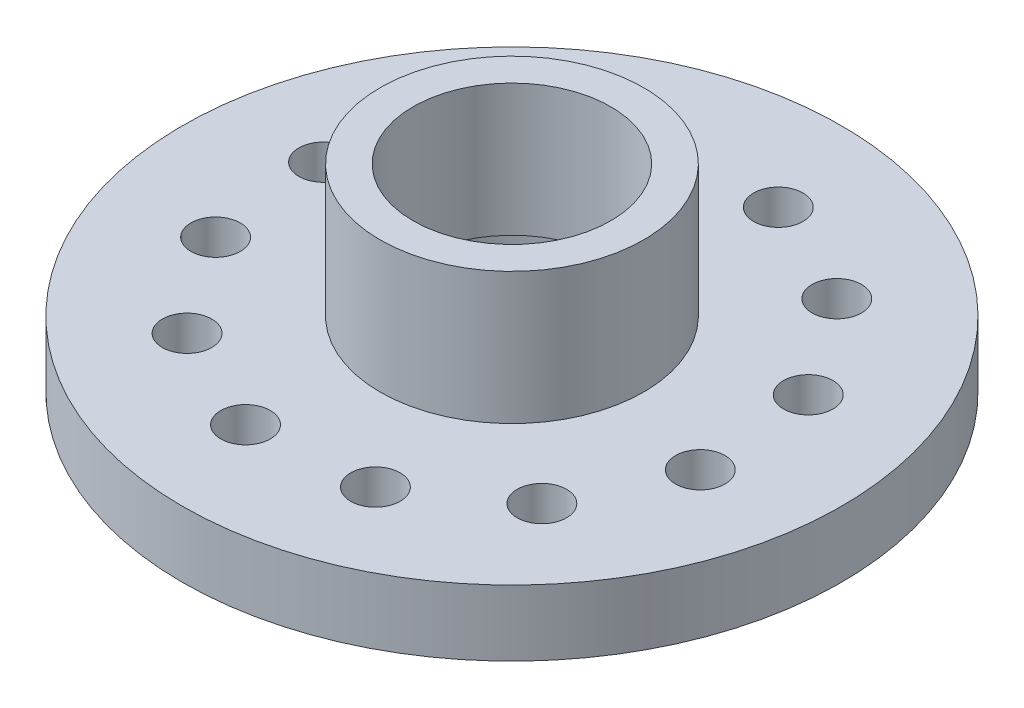
ISO-10303-21;
HEADER;
FILE_DESCRIPTION(('STEP AP214'),'2;1');
FILE_NAME('part.step','',(''),(''),'','','');
FILE_SCHEMA(('AUTOMOTIVE_DESIGN { 1 0 10303 214 1 1 1 1 }'));
ENDSEC;
DATA;
#1=APPLICATION_CONTEXT('core data for automotive mechanical design processes');
#2=APPLICATION_PROTOCOL_DEFINITION('international standard','automotive_design',2000,#1);
#3=PRODUCT_CONTEXT('',#1,'mechanical');
#4=PRODUCT('Part','Part','',(#3));
#5=PRODUCT_RELATED_PRODUCT_CATEGORY('part','',(#4));
#6=PRODUCT_DEFINITION_FORMATION('','',#4);
#7=PRODUCT_DEFINITION_CONTEXT('part definition',#1,'design');
#8=PRODUCT_DEFINITION('design','',#6,#7);
#9=PRODUCT_DEFINITION_SHAPE('','',#8);
#10=(LENGTH_UNIT() NAMED_UNIT(*) SI_UNIT(.MILLI.,.METRE.));
#11=(NAMED_UNIT(*) PLANE_ANGLE_UNIT() SI_UNIT($,.RADIAN.));
#12=(NAMED_UNIT(*) SI_UNIT($,.STERADIAN.) SOLID_ANGLE_UNIT());
#13=UNCERTAINTY_MEASURE_WITH_UNIT(LENGTH_MEASURE(1.E-05),#10,'distance_accuracy_value','');
#14=(GEOMETRIC_REPRESENTATION_CONTEXT(3) GLOBAL_UNCERTAINTY_ASSIGNED_CONTEXT((#13)) GLOBAL_UNIT_ASSIGNED_CONTEXT((#10,
#11,#12)) REPRESENTATION_CONTEXT('',''));
#15=CARTESIAN_POINT('',(0.,0.,0.));
#16=DIRECTION('',(0.,0.,1.));
#17=DIRECTION('',(1.,0.,0.));
#18=AXIS2_PLACEMENT_3D('',#15,#16,#17);
#19=CARTESIAN_POINT('',(0.,6.,0.));
#20=DIRECTION('',(0.,1.,0.));
#21=DIRECTION('',(0.,0.,1.));
#22=AXIS2_PLACEMENT_3D('',#19,#20,#21);
#23=PLANE('',#22);
#24=CARTESIAN_POINT('',(0.,6.,0.));
#25=DIRECTION('',(0.,1.,0.));
#26=DIRECTION('',(0.,0.,1.));
#27=AXIS2_PLACEMENT_3D('',#24,#25,#26);
#28=CIRCLE('',#27,4.);
#29=CARTESIAN_POINT('',(0.,6.,4.));
#30=VERTEX_POINT('',#29);
#31=EDGE_CURVE('E11',#30,#30,#28,.T.);
#32=ORIENTED_EDGE('',*,*,#31,.T.);
#33=EDGE_LOOP('',(#32));
#34=FACE_BOUND('',#33,.T.);
#35=CARTESIAN_POINT('',(0.,6.,0.));
#36=DIRECTION('',(0.,1.,0.));
#37=DIRECTION('',(0.,0.,1.));
#38=AXIS2_PLACEMENT_3D('',#35,#36,#37);
#39=CIRCLE('',#38,3.);
#40=CARTESIAN_POINT('',(0.,6.,3.));
#41=VERTEX_POINT('',#40);
#42=EDGE_CURVE('E59',#41,#41,#39,.T.);
#43=ORIENTED_EDGE('',*,*,#42,.F.);
#44=EDGE_LOOP('',(#43));
#45=FACE_BOUND('',#44,.T.);
#46=ADVANCED_FACE('F48',(#34,#45),#23,.T.);
#47=CARTESIAN_POINT('',(0.,2.,0.));
#48=DIRECTION('',(0.,1.,0.));
#49=DIRECTION('',(0.,0.,1.));
#50=AXIS2_PLACEMENT_3D('',#47,#48,#49);
#51=PLANE('',#50);
#52=CARTESIAN_POINT('',(0.,2.,0.));
#53=DIRECTION('',(0.,1.,0.));
#54=DIRECTION('',(0.,0.,1.));
#55=AXIS2_PLACEMENT_3D('',#52,#53,#54);
#56=CIRCLE('',#55,4.);
#57=CARTESIAN_POINT('',(0.,2.,4.));
#58=VERTEX_POINT('',#57);
#59=EDGE_CURVE('E52',#58,#58,#56,.T.);
#60=ORIENTED_EDGE('',*,*,#59,.F.);
#61=EDGE_LOOP('',(#60));
#62=FACE_BOUND('',#61,.T.);
#63=CARTESIAN_POINT('',(0.,2.,0.));
#64=DIRECTION('',(0.,1.,0.));
#65=DIRECTION('',(0.,0.,1.));
#66=AXIS2_PLACEMENT_3D('',#63,#64,#65);
#67=CIRCLE('',#66,3.);
#68=CARTESIAN_POINT('',(0.,2.,3.));
#69=VERTEX_POINT('',#68);
#70=EDGE_CURVE('E61',#69,#69,#67,.T.);
#71=ORIENTED_EDGE('',*,*,#70,.T.);
#72=EDGE_LOOP('',(#71));
#73=FACE_BOUND('',#72,.T.);
#74=ADVANCED_FACE('F71',(#62,#73),#51,.F.);
#75=CARTESIAN_POINT('',(0.,6.,0.));
#76=DIRECTION('',(0.,-1.,0.));
#77=DIRECTION('',(0.,0.,-1.));
#78=AXIS2_PLACEMENT_3D('',#75,#76,#77);
#79=CYLINDRICAL_SURFACE('',#78,4.);
#80=ORIENTED_EDGE('',*,*,#31,.F.);
#81=EDGE_LOOP('',(#80));
#82=FACE_BOUND('',#81,.T.);
#83=ORIENTED_EDGE('',*,*,#59,.T.);
#84=EDGE_LOOP('',(#83));
#85=FACE_BOUND('',#84,.T.);
#86=ADVANCED_FACE('F50',(#82,#85),#79,.T.);
#87=CARTESIAN_POINT('',(0.,6.,0.));
#88=DIRECTION('',(0.,-1.,0.));
#89=DIRECTION('',(0.,0.,-1.));
#90=AXIS2_PLACEMENT_3D('',#87,#88,#89);
#91=CYLINDRICAL_SURFACE('',#90,3.);
#92=ORIENTED_EDGE('',*,*,#42,.T.);
#93=EDGE_LOOP('',(#92));
#94=FACE_BOUND('',#93,.T.);
#95=ORIENTED_EDGE('',*,*,#70,.F.);
#96=EDGE_LOOP('',(#95));
#97=FACE_BOUND('',#96,.T.);
#98=ADVANCED_FACE('F67',(#94,#97),#91,.F.);
#99=CLOSED_SHELL('',(#46,#74,#86,#98));
#100=MANIFOLD_SOLID_BREP('B2',#99);
#101=CARTESIAN_POINT('',(0.,2.,0.));
#102=DIRECTION('',(0.,1.,0.));
#103=DIRECTION('',(0.,0.,1.));
#104=AXIS2_PLACEMENT_3D('',#101,#102,#103);
#105=PLANE('',#104);
#106=CARTESIAN_POINT('',(-6.89920928041294,2.,-1.18360099064729));
#107=DIRECTION('',(0.,1.,0.));
#108=DIRECTION('',(0.,0.,1.));
#109=AXIS2_PLACEMENT_3D('',#106,#107,#108);
#110=CIRCLE('',#109,0.750000000000014);
#111=CARTESIAN_POINT('',(-6.89920928041294,2.,-0.433600990647278));
#112=VERTEX_POINT('',#111);
#113=EDGE_CURVE('E153',#112,#112,#110,.T.);
#114=ORIENTED_EDGE('',*,*,#113,.F.);
#115=EDGE_LOOP('',(#114));
#116=FACE_BOUND('',#115,.T.);
#117=CARTESIAN_POINT('',(-6.56669099818642,2.,2.42457611436157));
#118=DIRECTION('',(0.,1.,0.));
#119=DIRECTION('',(0.,0.,1.));
#120=AXIS2_PLACEMENT_3D('',#117,#118,#119);
#121=CIRCLE('',#120,0.75000000000005);
#122=CARTESIAN_POINT('',(-6.56669099818642,2.,3.17457611436162));
#123=VERTEX_POINT('',#122);
#124=EDGE_CURVE('E161',#123,#123,#121,.T.);
#125=ORIENTED_EDGE('',*,*,#124,.F.);
#126=EDGE_LOOP('',(#125));
#127=FACE_BOUND('',#126,.T.);
#128=CARTESIAN_POINT('',(-4.47463316605106,2.,5.38309000753938));
#129=DIRECTION('',(0.,1.,0.));
#130=DIRECTION('',(0.,0.,1.));
#131=AXIS2_PLACEMENT_3D('',#128,#129,#130);
#132=CIRCLE('',#131,0.750000000000178);
#133=CARTESIAN_POINT('',(-4.47463316605106,2.,6.13309000753956));
#134=VERTEX_POINT('',#133);
#135=EDGE_CURVE('E169',#134,#134,#132,.T.);
#136=ORIENTED_EDGE('',*,*,#135,.F.);
#137=EDGE_LOOP('',(#136));
#138=FACE_BOUND('',#137,.T.);
#139=CARTESIAN_POINT('',(-1.18360099064673,2.,6.89920928041289));
#140=DIRECTION('',(0.,1.,0.));
#141=DIRECTION('',(0.,0.,1.));
#142=AXIS2_PLACEMENT_3D('',#139,#140,#141);
#143=CIRCLE('',#142,0.750000000000367);
#144=CARTESIAN_POINT('',(-1.18360099064673,2.,7.64920928041325));
#145=VERTEX_POINT('',#144);
#146=EDGE_CURVE('E177',#145,#145,#143,.T.);
#147=ORIENTED_EDGE('',*,*,#146,.F.);
#148=EDGE_LOOP('',(#147));
#149=FACE_BOUND('',#148,.T.);
#150=CARTESIAN_POINT('',(2.42457611436213,2.,6.56669099818637));
#151=DIRECTION('',(0.,1.,0.));
#152=DIRECTION('',(0.,0.,1.));
#153=AXIS2_PLACEMENT_3D('',#150,#151,#152);
#154=CIRCLE('',#153,0.750000000000559);
#155=CARTESIAN_POINT('',(2.42457611436213,2.,7.31669099818693));
#156=VERTEX_POINT('',#155);
#157=EDGE_CURVE('E185',#156,#156,#154,.T.);
#158=ORIENTED_EDGE('',*,*,#157,.F.);
#159=EDGE_LOOP('',(#158));
#160=FACE_BOUND('',#159,.T.);
#161=CARTESIAN_POINT('',(5.38309000753994,2.,4.47463316605101));
#162=DIRECTION('',(0.,1.,0.));
#163=DIRECTION('',(0.,0.,1.));
#164=AXIS2_PLACEMENT_3D('',#161,#162,#163);
#165=CIRCLE('',#164,0.750000000000704);
#166=CARTESIAN_POINT('',(5.38309000753994,2.,5.22463316605172));
#167=VERTEX_POINT('',#166);
#168=EDGE_CURVE('E193',#167,#167,#165,.T.);
#169=ORIENTED_EDGE('',*,*,#168,.F.);
#170=EDGE_LOOP('',(#169));
#171=FACE_BOUND('',#170,.T.);
#172=CARTESIAN_POINT('',(6.89920928041344,2.,1.18360099064669));
#173=DIRECTION('',(0.,1.,0.));
#174=DIRECTION('',(0.,0.,1.));
#175=AXIS2_PLACEMENT_3D('',#172,#173,#174);
#176=CIRCLE('',#175,0.750000000000763);
#177=CARTESIAN_POINT('',(6.89920928041344,2.,1.93360099064745));
#178=VERTEX_POINT('',#177);
#179=EDGE_CURVE('E201',#178,#178,#176,.T.);
#180=ORIENTED_EDGE('',*,*,#179,.F.);
#181=EDGE_LOOP('',(#180));
#182=FACE_BOUND('',#181,.T.);
#183=CARTESIAN_POINT('',(6.56669099818693,2.,-2.42457611436218));
#184=DIRECTION('',(0.,1.,0.));
#185=DIRECTION('',(0.,0.,1.));
#186=AXIS2_PLACEMENT_3D('',#183,#184,#185);
#187=CIRCLE('',#186,0.750000000000714);
#188=CARTESIAN_POINT('',(6.56669099818693,2.,-1.67457611436146));
#189=VERTEX_POINT('',#188);
#190=EDGE_CURVE('E209',#189,#189,#187,.T.);
#191=ORIENTED_EDGE('',*,*,#190,.F.);
#192=EDGE_LOOP('',(#191));
#193=FACE_BOUND('',#192,.T.);
#194=CARTESIAN_POINT('',(4.47463316605157,2.,-5.38309000753999));
#195=DIRECTION('',(0.,1.,0.));
#196=DIRECTION('',(0.,0.,1.));
#197=AXIS2_PLACEMENT_3D('',#194,#195,#196);
#198=CIRCLE('',#197,0.750000000000567);
#199=CARTESIAN_POINT('',(4.47463316605157,2.,-4.63309000753942));
#200=VERTEX_POINT('',#199);
#201=EDGE_CURVE('E217',#200,#200,#198,.T.);
#202=ORIENTED_EDGE('',*,*,#201,.F.);
#203=EDGE_LOOP('',(#202));
#204=FACE_BOUND('',#203,.T.);
#205=CARTESIAN_POINT('',(1.18360099064725,2.,-6.89920928041349));
#206=DIRECTION('',(0.,1.,0.));
#207=DIRECTION('',(0.,0.,1.));
#208=AXIS2_PLACEMENT_3D('',#205,#206,#207);
#209=CIRCLE('',#208,0.750000000000366);
#210=CARTESIAN_POINT('',(1.18360099064725,2.,-6.14920928041313));
#211=VERTEX_POINT('',#210);
#212=EDGE_CURVE('E225',#211,#211,#209,.T.);
#213=ORIENTED_EDGE('',*,*,#212,.F.);
#214=EDGE_LOOP('',(#213));
#215=FACE_BOUND('',#214,.T.);
#216=CARTESIAN_POINT('',(-2.42457611436162,2.,-6.56669099818698));
#217=DIRECTION('',(0.,1.,0.));
#218=DIRECTION('',(0.,0.,1.));
#219=AXIS2_PLACEMENT_3D('',#216,#217,#218);
#220=CIRCLE('',#219,0.750000000000157);
#221=CARTESIAN_POINT('',(-2.42457611436162,2.,-5.81669099818682));
#222=VERTEX_POINT('',#221);
#223=EDGE_CURVE('E145',#222,#222,#220,.T.);
#224=ORIENTED_EDGE('',*,*,#223,.F.);
#225=EDGE_LOOP('',(#224));
#226=FACE_BOUND('',#225,.T.);
#227=CARTESIAN_POINT('',(-5.38309000753943,2.,-4.47463316605162));
#228=DIRECTION('',(0.,1.,0.));
#229=DIRECTION('',(0.,0.,1.));
#230=AXIS2_PLACEMENT_3D('',#227,#228,#229);
#231=CIRCLE('',#230,0.749999999999999);
#232=CARTESIAN_POINT('',(-5.38309000753943,2.,-3.72463316605162));
#233=VERTEX_POINT('',#232);
#234=EDGE_CURVE('E141',#233,#233,#231,.T.);
#235=ORIENTED_EDGE('',*,*,#234,.F.);
#236=EDGE_LOOP('',(#235));
#237=FACE_BOUND('',#236,.T.);
#238=CARTESIAN_POINT('',(0.,2.,0.));
#239=DIRECTION('',(0.,1.,0.));
#240=DIRECTION('',(0.,0.,1.));
#241=AXIS2_PLACEMENT_3D('',#238,#239,#240);
#242=CIRCLE('',#241,9.99999999999979);
#243=CARTESIAN_POINT('',(0.,2.,9.99999999999979));
#244=VERTEX_POINT('',#243);
#245=EDGE_CURVE('E47',#244,#244,#242,.T.);
#246=ORIENTED_EDGE('',*,*,#245,.T.);
#247=EDGE_LOOP('',(#246));
#248=FACE_BOUND('',#247,.T.);
#249=CARTESIAN_POINT('',(0.,2.,0.));
#250=DIRECTION('',(0.,1.,0.));
#251=DIRECTION('',(0.,0.,1.));
#252=AXIS2_PLACEMENT_3D('',#249,#250,#251);
#253=CIRCLE('',#252,4.);
#254=CARTESIAN_POINT('',(0.,2.,4.));
#255=VERTEX_POINT('',#254);
#256=EDGE_CURVE('E131',#255,#255,#253,.T.);
#257=ORIENTED_EDGE('',*,*,#256,.F.);
#258=EDGE_LOOP('',(#257));
#259=FACE_BOUND('',#258,.T.);
#260=ADVANCED_FACE('F118',(#116,#127,#138,#149,#160,#171,#182,#193,#204,#215,#226,#237,#248,
#259),#105,.T.);
#261=CARTESIAN_POINT('',(0.,0.,0.));
#262=DIRECTION('',(0.,1.,0.));
#263=DIRECTION('',(0.,0.,1.));
#264=AXIS2_PLACEMENT_3D('',#261,#262,#263);
#265=PLANE('',#264);
#266=CARTESIAN_POINT('',(-6.89920928041294,0.,-1.18360099064729));
#267=DIRECTION('',(0.,1.,0.));
#268=DIRECTION('',(0.,0.,1.));
#269=AXIS2_PLACEMENT_3D('',#266,#267,#268);
#270=CIRCLE('',#269,0.750000000000014);
#271=CARTESIAN_POINT('',(-6.89920928041294,0.,-0.433600990647278));
#272=VERTEX_POINT('',#271);
#273=EDGE_CURVE('E149',#272,#272,#270,.T.);
#274=ORIENTED_EDGE('',*,*,#273,.T.);
#275=EDGE_LOOP('',(#274));
#276=FACE_BOUND('',#275,.T.);
#277=CARTESIAN_POINT('',(-6.56669099818642,0.,2.42457611436157));
#278=DIRECTION('',(0.,1.,0.));
#279=DIRECTION('',(0.,0.,1.));
#280=AXIS2_PLACEMENT_3D('',#277,#278,#279);
#281=CIRCLE('',#280,0.75000000000005);
#282=CARTESIAN_POINT('',(-6.56669099818642,0.,3.17457611436162));
#283=VERTEX_POINT('',#282);
#284=EDGE_CURVE('E157',#283,#283,#281,.T.);
#285=ORIENTED_EDGE('',*,*,#284,.T.);
#286=EDGE_LOOP('',(#285));
#287=FACE_BOUND('',#286,.T.);
#288=CARTESIAN_POINT('',(-4.47463316605106,0.,5.38309000753938));
#289=DIRECTION('',(0.,1.,0.));
#290=DIRECTION('',(0.,0.,1.));
#291=AXIS2_PLACEMENT_3D('',#288,#289,#290);
#292=CIRCLE('',#291,0.750000000000178);
#293=CARTESIAN_POINT('',(-4.47463316605106,0.,6.13309000753956));
#294=VERTEX_POINT('',#293);
#295=EDGE_CURVE('E165',#294,#294,#292,.T.);
#296=ORIENTED_EDGE('',*,*,#295,.T.);
#297=EDGE_LOOP('',(#296));
#298=FACE_BOUND('',#297,.T.);
#299=CARTESIAN_POINT('',(-1.18360099064673,0.,6.89920928041289));
#300=DIRECTION('',(0.,1.,0.));
#301=DIRECTION('',(0.,0.,1.));
#302=AXIS2_PLACEMENT_3D('',#299,#300,#301);
#303=CIRCLE('',#302,0.750000000000367);
#304=CARTESIAN_POINT('',(-1.18360099064673,0.,7.64920928041325));
#305=VERTEX_POINT('',#304);
#306=EDGE_CURVE('E173',#305,#305,#303,.T.);
#307=ORIENTED_EDGE('',*,*,#306,.T.);
#308=EDGE_LOOP('',(#307));
#309=FACE_BOUND('',#308,.T.);
#310=CARTESIAN_POINT('',(2.42457611436213,0.,6.56669099818637));
#311=DIRECTION('',(0.,1.,0.));
#312=DIRECTION('',(0.,0.,1.));
#313=AXIS2_PLACEMENT_3D('',#310,#311,#312);
#314=CIRCLE('',#313,0.750000000000559);
#315=CARTESIAN_POINT('',(2.42457611436213,0.,7.31669099818693));
#316=VERTEX_POINT('',#315);
#317=EDGE_CURVE('E181',#316,#316,#314,.T.);
#318=ORIENTED_EDGE('',*,*,#317,.T.);
#319=EDGE_LOOP('',(#318));
#320=FACE_BOUND('',#319,.T.);
#321=CARTESIAN_POINT('',(5.38309000753994,0.,4.47463316605101));
#322=DIRECTION('',(0.,1.,0.));
#323=DIRECTION('',(0.,0.,1.));
#324=AXIS2_PLACEMENT_3D('',#321,#322,#323);
#325=CIRCLE('',#324,0.750000000000704);
#326=CARTESIAN_POINT('',(5.38309000753994,0.,5.22463316605172));
#327=VERTEX_POINT('',#326);
#328=EDGE_CURVE('E189',#327,#327,#325,.T.);
#329=ORIENTED_EDGE('',*,*,#328,.T.);
#330=EDGE_LOOP('',(#329));
#331=FACE_BOUND('',#330,.T.);
#332=CARTESIAN_POINT('',(6.89920928041344,0.,1.18360099064669));
#333=DIRECTION('',(0.,1.,0.));
#334=DIRECTION('',(0.,0.,1.));
#335=AXIS2_PLACEMENT_3D('',#332,#333,#334);
#336=CIRCLE('',#335,0.750000000000763);
#337=CARTESIAN_POINT('',(6.89920928041344,0.,1.93360099064745));
#338=VERTEX_POINT('',#337);
#339=EDGE_CURVE('E197',#338,#338,#336,.T.);
#340=ORIENTED_EDGE('',*,*,#339,.T.);
#341=EDGE_LOOP('',(#340));
#342=FACE_BOUND('',#341,.T.);
#343=CARTESIAN_POINT('',(6.56669099818693,0.,-2.42457611436218));
#344=DIRECTION('',(0.,1.,0.));
#345=DIRECTION('',(0.,0.,1.));
#346=AXIS2_PLACEMENT_3D('',#343,#344,#345);
#347=CIRCLE('',#346,0.750000000000714);
#348=CARTESIAN_POINT('',(6.56669099818693,0.,-1.67457611436146));
#349=VERTEX_POINT('',#348);
#350=EDGE_CURVE('E205',#349,#349,#347,.T.);
#351=ORIENTED_EDGE('',*,*,#350,.T.);
#352=EDGE_LOOP('',(#351));
#353=FACE_BOUND('',#352,.T.);
#354=CARTESIAN_POINT('',(4.47463316605157,0.,-5.38309000753999));
#355=DIRECTION('',(0.,1.,0.));
#356=DIRECTION('',(0.,0.,1.));
#357=AXIS2_PLACEMENT_3D('',#354,#355,#356);
#358=CIRCLE('',#357,0.750000000000567);
#359=CARTESIAN_POINT('',(4.47463316605157,0.,-4.63309000753942));
#360=VERTEX_POINT('',#359);
#361=EDGE_CURVE('E213',#360,#360,#358,.T.);
#362=ORIENTED_EDGE('',*,*,#361,.T.);
#363=EDGE_LOOP('',(#362));
#364=FACE_BOUND('',#363,.T.);
#365=CARTESIAN_POINT('',(1.18360099064725,0.,-6.89920928041349));
#366=DIRECTION('',(0.,1.,0.));
#367=DIRECTION('',(0.,0.,1.));
#368=AXIS2_PLACEMENT_3D('',#365,#366,#367);
#369=CIRCLE('',#368,0.750000000000366);
#370=CARTESIAN_POINT('',(1.18360099064725,0.,-6.14920928041313));
#371=VERTEX_POINT('',#370);
#372=EDGE_CURVE('E221',#371,#371,#369,.T.);
#373=ORIENTED_EDGE('',*,*,#372,.T.);
#374=EDGE_LOOP('',(#373));
#375=FACE_BOUND('',#374,.T.);
#376=CARTESIAN_POINT('',(-2.42457611436162,0.,-6.56669099818698));
#377=DIRECTION('',(0.,1.,0.));
#378=DIRECTION('',(0.,0.,1.));
#379=AXIS2_PLACEMENT_3D('',#376,#377,#378);
#380=CIRCLE('',#379,0.750000000000157);
#381=CARTESIAN_POINT('',(-2.42457611436162,0.,-5.81669099818682));
#382=VERTEX_POINT('',#381);
#383=EDGE_CURVE('E229',#382,#382,#380,.T.);
#384=ORIENTED_EDGE('',*,*,#383,.T.);
#385=EDGE_LOOP('',(#384));
#386=FACE_BOUND('',#385,.T.);
#387=CARTESIAN_POINT('',(-5.38309000753943,0.,-4.47463316605162));
#388=DIRECTION('',(0.,1.,0.));
#389=DIRECTION('',(0.,0.,1.));
#390=AXIS2_PLACEMENT_3D('',#387,#388,#389);
#391=CIRCLE('',#390,0.749999999999999);
#392=CARTESIAN_POINT('',(-5.38309000753943,0.,-3.72463316605162));
#393=VERTEX_POINT('',#392);
#394=EDGE_CURVE('E137',#393,#393,#391,.T.);
#395=ORIENTED_EDGE('',*,*,#394,.T.);
#396=EDGE_LOOP('',(#395));
#397=FACE_BOUND('',#396,.T.);
#398=CARTESIAN_POINT('',(0.,0.,0.));
#399=DIRECTION('',(0.,1.,0.));
#400=DIRECTION('',(0.,0.,1.));
#401=AXIS2_PLACEMENT_3D('',#398,#399,#400);
#402=CIRCLE('',#401,9.99999999999979);
#403=CARTESIAN_POINT('',(0.,0.,9.99999999999979));
#404=VERTEX_POINT('',#403);
#405=EDGE_CURVE('E122',#404,#404,#402,.T.);
#406=ORIENTED_EDGE('',*,*,#405,.F.);
#407=EDGE_LOOP('',(#406));
#408=FACE_BOUND('',#407,.T.);
#409=CARTESIAN_POINT('',(0.,0.,0.));
#410=DIRECTION('',(0.,1.,0.));
#411=DIRECTION('',(0.,0.,1.));
#412=AXIS2_PLACEMENT_3D('',#409,#410,#411);
#413=CIRCLE('',#412,4.);
#414=CARTESIAN_POINT('',(0.,0.,4.));
#415=VERTEX_POINT('',#414);
#416=EDGE_CURVE('E133',#415,#415,#413,.T.);
#417=ORIENTED_EDGE('',*,*,#416,.T.);
#418=EDGE_LOOP('',(#417));
#419=FACE_BOUND('',#418,.T.);
#420=ADVANCED_FACE('F241',(#276,#287,#298,#309,#320,#331,#342,#353,#364,#375,#386,#397,#408,
#419),#265,.F.);
#421=CARTESIAN_POINT('',(0.,2.,0.));
#422=DIRECTION('',(0.,-1.,0.));
#423=DIRECTION('',(0.,0.,-1.));
#424=AXIS2_PLACEMENT_3D('',#421,#422,#423);
#425=CYLINDRICAL_SURFACE('',#424,9.99999999999979);
#426=ORIENTED_EDGE('',*,*,#245,.F.);
#427=EDGE_LOOP('',(#426));
#428=FACE_BOUND('',#427,.T.);
#429=ORIENTED_EDGE('',*,*,#405,.T.);
#430=EDGE_LOOP('',(#429));
#431=FACE_BOUND('',#430,.T.);
#432=ADVANCED_FACE('F120',(#428,#431),#425,.T.);
#433=CARTESIAN_POINT('',(0.,2.,0.));
#434=DIRECTION('',(0.,-1.,0.));
#435=DIRECTION('',(0.,0.,-1.));
#436=AXIS2_PLACEMENT_3D('',#433,#434,#435);
#437=CYLINDRICAL_SURFACE('',#436,4.);
#438=ORIENTED_EDGE('',*,*,#256,.T.);
#439=EDGE_LOOP('',(#438));
#440=FACE_BOUND('',#439,.T.);
#441=ORIENTED_EDGE('',*,*,#416,.F.);
#442=EDGE_LOOP('',(#441));
#443=FACE_BOUND('',#442,.T.);
#444=ADVANCED_FACE('F248',(#440,#443),#437,.F.);
#445=CARTESIAN_POINT('',(-5.38309000753943,0.,-4.47463316605162));
#446=DIRECTION('',(0.,1.,0.));
#447=DIRECTION('',(0.,0.,1.));
#448=AXIS2_PLACEMENT_3D('',#445,#446,#447);
#449=CYLINDRICAL_SURFACE('',#448,0.749999999999999);
#450=ORIENTED_EDGE('',*,*,#394,.F.);
#451=EDGE_LOOP('',(#450));
#452=FACE_BOUND('',#451,.T.);
#453=ORIENTED_EDGE('',*,*,#234,.T.);
#454=EDGE_LOOP('',(#453));
#455=FACE_BOUND('',#454,.T.);
#456=ADVANCED_FACE('F251',(#452,#455),#449,.F.);
#457=CARTESIAN_POINT('',(-2.42457611436162,0.,-6.56669099818698));
#458=DIRECTION('',(0.,1.,0.));
#459=DIRECTION('',(0.,0.,1.));
#460=AXIS2_PLACEMENT_3D('',#457,#458,#459);
#461=CYLINDRICAL_SURFACE('',#460,0.750000000000157);
#462=ORIENTED_EDGE('',*,*,#383,.F.);
#463=EDGE_LOOP('',(#462));
#464=FACE_BOUND('',#463,.T.);
#465=ORIENTED_EDGE('',*,*,#223,.T.);
#466=EDGE_LOOP('',(#465));
#467=FACE_BOUND('',#466,.T.);
#468=ADVANCED_FACE('F237',(#464,#467),#461,.F.);
#469=CARTESIAN_POINT('',(1.18360099064725,0.,-6.89920928041349));
#470=DIRECTION('',(0.,1.,0.));
#471=DIRECTION('',(0.,0.,1.));
#472=AXIS2_PLACEMENT_3D('',#469,#470,#471);
#473=CYLINDRICAL_SURFACE('',#472,0.750000000000366);
#474=ORIENTED_EDGE('',*,*,#372,.F.);
#475=EDGE_LOOP('',(#474));
#476=FACE_BOUND('',#475,.T.);
#477=ORIENTED_EDGE('',*,*,#212,.T.);
#478=EDGE_LOOP('',(#477));
#479=FACE_BOUND('',#478,.T.);
#480=ADVANCED_FACE('F301',(#476,#479),#473,.F.);
#481=CARTESIAN_POINT('',(4.47463316605157,0.,-5.38309000753999));
#482=DIRECTION('',(0.,1.,0.));
#483=DIRECTION('',(0.,0.,1.));
#484=AXIS2_PLACEMENT_3D('',#481,#482,#483);
#485=CYLINDRICAL_SURFACE('',#484,0.750000000000567);
#486=ORIENTED_EDGE('',*,*,#361,.F.);
#487=EDGE_LOOP('',(#486));
#488=FACE_BOUND('',#487,.T.);
#489=ORIENTED_EDGE('',*,*,#201,.T.);
#490=EDGE_LOOP('',(#489));
#491=FACE_BOUND('',#490,.T.);
#492=ADVANCED_FACE('F297',(#488,#491),#485,.F.);
#493=CARTESIAN_POINT('',(6.56669099818693,0.,-2.42457611436218));
#494=DIRECTION('',(0.,1.,0.));
#495=DIRECTION('',(0.,0.,1.));
#496=AXIS2_PLACEMENT_3D('',#493,#494,#495);
#497=CYLINDRICAL_SURFACE('',#496,0.750000000000714);
#498=ORIENTED_EDGE('',*,*,#350,.F.);
#499=EDGE_LOOP('',(#498));
#500=FACE_BOUND('',#499,.T.);
#501=ORIENTED_EDGE('',*,*,#190,.T.);
#502=EDGE_LOOP('',(#501));
#503=FACE_BOUND('',#502,.T.);
#504=ADVANCED_FACE('F293',(#500,#503),#497,.F.);
#505=CARTESIAN_POINT('',(6.89920928041344,0.,1.18360099064669));
#506=DIRECTION('',(0.,1.,0.));
#507=DIRECTION('',(0.,0.,1.));
#508=AXIS2_PLACEMENT_3D('',#505,#506,#507);
#509=CYLINDRICAL_SURFACE('',#508,0.750000000000763);
#510=ORIENTED_EDGE('',*,*,#339,.F.);
#511=EDGE_LOOP('',(#510));
#512=FACE_BOUND('',#511,.T.);
#513=ORIENTED_EDGE('',*,*,#179,.T.);
#514=EDGE_LOOP('',(#513));
#515=FACE_BOUND('',#514,.T.);
#516=ADVANCED_FACE('F289',(#512,#515),#509,.F.);
#517=CARTESIAN_POINT('',(5.38309000753994,0.,4.47463316605101));
#518=DIRECTION('',(0.,1.,0.));
#519=DIRECTION('',(0.,0.,1.));
#520=AXIS2_PLACEMENT_3D('',#517,#518,#519);
#521=CYLINDRICAL_SURFACE('',#520,0.750000000000704);
#522=ORIENTED_EDGE('',*,*,#328,.F.);
#523=EDGE_LOOP('',(#522));
#524=FACE_BOUND('',#523,.T.);
#525=ORIENTED_EDGE('',*,*,#168,.T.);
#526=EDGE_LOOP('',(#525));
#527=FACE_BOUND('',#526,.T.);
#528=ADVANCED_FACE('F285',(#524,#527),#521,.F.);
#529=CARTESIAN_POINT('',(2.42457611436213,0.,6.56669099818637));
#530=DIRECTION('',(0.,1.,0.));
#531=DIRECTION('',(0.,0.,1.));
#532=AXIS2_PLACEMENT_3D('',#529,#530,#531);
#533=CYLINDRICAL_SURFACE('',#532,0.750000000000559);
#534=ORIENTED_EDGE('',*,*,#317,.F.);
#535=EDGE_LOOP('',(#534));
#536=FACE_BOUND('',#535,.T.);
#537=ORIENTED_EDGE('',*,*,#157,.T.);
#538=EDGE_LOOP('',(#537));
#539=FACE_BOUND('',#538,.T.);
#540=ADVANCED_FACE('F281',(#536,#539),#533,.F.);
#541=CARTESIAN_POINT('',(-1.18360099064673,0.,6.89920928041289));
#542=DIRECTION('',(0.,1.,0.));
#543=DIRECTION('',(0.,0.,1.));
#544=AXIS2_PLACEMENT_3D('',#541,#542,#543);
#545=CYLINDRICAL_SURFACE('',#544,0.750000000000367);
#546=ORIENTED_EDGE('',*,*,#306,.F.);
#547=EDGE_LOOP('',(#546));
#548=FACE_BOUND('',#547,.T.);
#549=ORIENTED_EDGE('',*,*,#146,.T.);
#550=EDGE_LOOP('',(#549));
#551=FACE_BOUND('',#550,.T.);
#552=ADVANCED_FACE('F277',(#548,#551),#545,.F.);
#553=CARTESIAN_POINT('',(-4.47463316605106,0.,5.38309000753938));
#554=DIRECTION('',(0.,1.,0.));
#555=DIRECTION('',(0.,0.,1.));
#556=AXIS2_PLACEMENT_3D('',#553,#554,#555);
#557=CYLINDRICAL_SURFACE('',#556,0.750000000000178);
#558=ORIENTED_EDGE('',*,*,#295,.F.);
#559=EDGE_LOOP('',(#558));
#560=FACE_BOUND('',#559,.T.);
#561=ORIENTED_EDGE('',*,*,#135,.T.);
#562=EDGE_LOOP('',(#561));
#563=FACE_BOUND('',#562,.T.);
#564=ADVANCED_FACE('F273',(#560,#563),#557,.F.);
#565=CARTESIAN_POINT('',(-6.56669099818642,0.,2.42457611436157));
#566=DIRECTION('',(0.,1.,0.));
#567=DIRECTION('',(0.,0.,1.));
#568=AXIS2_PLACEMENT_3D('',#565,#566,#567);
#569=CYLINDRICAL_SURFACE('',#568,0.75000000000005);
#570=ORIENTED_EDGE('',*,*,#284,.F.);
#571=EDGE_LOOP('',(#570));
#572=FACE_BOUND('',#571,.T.);
#573=ORIENTED_EDGE('',*,*,#124,.T.);
#574=EDGE_LOOP('',(#573));
#575=FACE_BOUND('',#574,.T.);
#576=ADVANCED_FACE('F269',(#572,#575),#569,.F.);
#577=CARTESIAN_POINT('',(-6.89920928041294,0.,-1.18360099064729));
#578=DIRECTION('',(0.,1.,0.));
#579=DIRECTION('',(0.,0.,1.));
#580=AXIS2_PLACEMENT_3D('',#577,#578,#579);
#581=CYLINDRICAL_SURFACE('',#580,0.750000000000014);
#582=ORIENTED_EDGE('',*,*,#273,.F.);
#583=EDGE_LOOP('',(#582));
#584=FACE_BOUND('',#583,.T.);
#585=ORIENTED_EDGE('',*,*,#113,.T.);
#586=EDGE_LOOP('',(#585));
#587=FACE_BOUND('',#586,.T.);
#588=ADVANCED_FACE('F266',(#584,#587),#581,.F.);
#589=CLOSED_SHELL('',(#260,#420,#432,#444,#456,#468,#480,#492,#504,#516,#528,#540,#552,#564,
#576,#588));
#590=MANIFOLD_SOLID_BREP('B6',#589);
#591=ADVANCED_BREP_SHAPE_REPRESENTATION('',(#18,#100,#590),#14);
#592=SHAPE_DEFINITION_REPRESENTATION(#9,#591);
ENDSEC;
END-ISO-10303-21;
